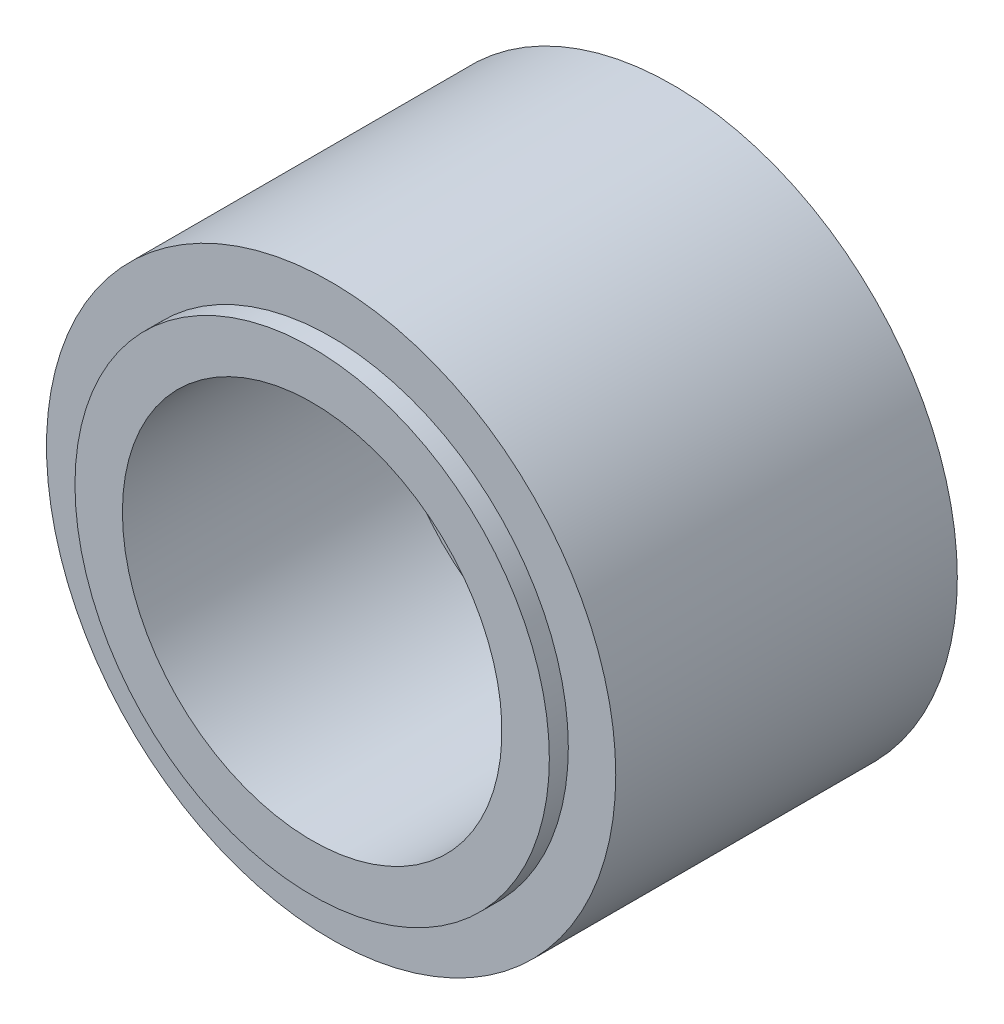
ISO-10303-21;
HEADER;
FILE_DESCRIPTION(('STEP AP214'),'2;1');
FILE_NAME('part.step','',(''),(''),'','','');
FILE_SCHEMA(('AUTOMOTIVE_DESIGN { 1 0 10303 214 1 1 1 1 }'));
ENDSEC;
DATA;
#1=APPLICATION_CONTEXT('core data for automotive mechanical design processes');
#2=APPLICATION_PROTOCOL_DEFINITION('international standard','automotive_design',2000,#1);
#3=PRODUCT_CONTEXT('',#1,'mechanical');
#4=PRODUCT('Part','Part','',(#3));
#5=PRODUCT_RELATED_PRODUCT_CATEGORY('part','',(#4));
#6=PRODUCT_DEFINITION_FORMATION('','',#4);
#7=PRODUCT_DEFINITION_CONTEXT('part definition',#1,'design');
#8=PRODUCT_DEFINITION('design','',#6,#7);
#9=PRODUCT_DEFINITION_SHAPE('','',#8);
#10=(LENGTH_UNIT() NAMED_UNIT(*) SI_UNIT(.MILLI.,.METRE.));
#11=(NAMED_UNIT(*) PLANE_ANGLE_UNIT() SI_UNIT($,.RADIAN.));
#12=(NAMED_UNIT(*) SI_UNIT($,.STERADIAN.) SOLID_ANGLE_UNIT());
#13=UNCERTAINTY_MEASURE_WITH_UNIT(LENGTH_MEASURE(1.E-05),#10,'distance_accuracy_value','');
#14=(GEOMETRIC_REPRESENTATION_CONTEXT(3) GLOBAL_UNCERTAINTY_ASSIGNED_CONTEXT((#13)) GLOBAL_UNIT_ASSIGNED_CONTEXT((#10,
#11,#12)) REPRESENTATION_CONTEXT('',''));
#15=CARTESIAN_POINT('',(0.,0.,0.));
#16=DIRECTION('',(0.,0.,1.));
#17=DIRECTION('',(1.,0.,0.));
#18=AXIS2_PLACEMENT_3D('',#15,#16,#17);
#19=CARTESIAN_POINT('',(0.,0.,61.4264068711929));
#20=DIRECTION('',(0.,0.,-1.));
#21=DIRECTION('',(-1.,0.,0.));
#22=AXIS2_PLACEMENT_3D('',#19,#20,#21);
#23=CYLINDRICAL_SURFACE('',#22,15.);
#24=CARTESIAN_POINT('',(0.,0.,0.999999999999999));
#25=DIRECTION('',(0.,0.,1.));
#26=DIRECTION('',(1.,0.,0.));
#27=AXIS2_PLACEMENT_3D('',#24,#25,#26);
#28=CIRCLE('',#27,15.);
#29=CARTESIAN_POINT('',(15.,0.,0.999999999999999));
#30=VERTEX_POINT('',#29);
#31=EDGE_CURVE('E61',#30,#30,#28,.T.);
#32=ORIENTED_EDGE('',*,*,#31,.T.);
#33=EDGE_LOOP('',(#32));
#34=FACE_BOUND('',#33,.T.);
#35=CARTESIAN_POINT('',(0.,0.,19.));
#36=DIRECTION('',(0.,0.,1.));
#37=DIRECTION('',(1.,0.,0.));
#38=AXIS2_PLACEMENT_3D('',#35,#36,#37);
#39=CIRCLE('',#38,15.);
#40=CARTESIAN_POINT('',(15.,0.,19.));
#41=VERTEX_POINT('',#40);
#42=EDGE_CURVE('E11',#41,#41,#39,.T.);
#43=ORIENTED_EDGE('',*,*,#42,.F.);
#44=EDGE_LOOP('',(#43));
#45=FACE_BOUND('',#44,.T.);
#46=ADVANCED_FACE('F54',(#34,#45),#23,.T.);
#47=CARTESIAN_POINT('',(0.,0.,0.999999999999999));
#48=DIRECTION('',(0.,0.,1.));
#49=DIRECTION('',(1.,0.,0.));
#50=AXIS2_PLACEMENT_3D('',#47,#48,#49);
#51=PLANE('',#50);
#52=ORIENTED_EDGE('',*,*,#31,.F.);
#53=EDGE_LOOP('',(#52));
#54=FACE_BOUND('',#53,.T.);
#55=CARTESIAN_POINT('',(0.,0.,0.999999999999999));
#56=DIRECTION('',(0.,0.,1.));
#57=DIRECTION('',(1.,0.,0.));
#58=AXIS2_PLACEMENT_3D('',#55,#56,#57);
#59=CIRCLE('',#58,12.5);
#60=CARTESIAN_POINT('',(12.5,0.,0.999999999999999));
#61=VERTEX_POINT('',#60);
#62=EDGE_CURVE('E66',#61,#61,#59,.T.);
#63=ORIENTED_EDGE('',*,*,#62,.T.);
#64=EDGE_LOOP('',(#63));
#65=FACE_BOUND('',#64,.T.);
#66=ADVANCED_FACE('F82',(#54,#65),#51,.F.);
#67=CARTESIAN_POINT('',(0.,0.,61.4264068711929));
#68=DIRECTION('',(0.,0.,-1.));
#69=DIRECTION('',(-1.,0.,0.));
#70=AXIS2_PLACEMENT_3D('',#67,#68,#69);
#71=CYLINDRICAL_SURFACE('',#70,12.5);
#72=ORIENTED_EDGE('',*,*,#62,.F.);
#73=EDGE_LOOP('',(#72));
#74=FACE_BOUND('',#73,.T.);
#75=CARTESIAN_POINT('',(0.,0.,19.));
#76=DIRECTION('',(0.,0.,1.));
#77=DIRECTION('',(1.,0.,0.));
#78=AXIS2_PLACEMENT_3D('',#75,#76,#77);
#79=CIRCLE('',#78,12.5);
#80=CARTESIAN_POINT('',(12.5,0.,19.));
#81=VERTEX_POINT('',#80);
#82=EDGE_CURVE('E57',#81,#81,#79,.T.);
#83=ORIENTED_EDGE('',*,*,#82,.T.);
#84=EDGE_LOOP('',(#83));
#85=FACE_BOUND('',#84,.T.);
#86=ADVANCED_FACE('F74',(#74,#85),#71,.F.);
#87=CARTESIAN_POINT('',(0.,-11.,19.));
#88=DIRECTION('',(0.,0.,1.));
#89=DIRECTION('',(1.,0.,0.));
#90=AXIS2_PLACEMENT_3D('',#87,#88,#89);
#91=PLANE('',#90);
#92=ORIENTED_EDGE('',*,*,#82,.F.);
#93=EDGE_LOOP('',(#92));
#94=FACE_BOUND('',#93,.T.);
#95=ORIENTED_EDGE('',*,*,#42,.T.);
#96=EDGE_LOOP('',(#95));
#97=FACE_BOUND('',#96,.T.);
#98=ADVANCED_FACE('F76',(#94,#97),#91,.T.);
#99=CLOSED_SHELL('',(#46,#66,#86,#98));
#100=MANIFOLD_SOLID_BREP('B2',#99);
#101=CARTESIAN_POINT('',(0.,0.,0.));
#102=DIRECTION('',(0.,0.,-1.));
#103=DIRECTION('',(-1.,0.,0.));
#104=AXIS2_PLACEMENT_3D('',#101,#102,#103);
#105=CYLINDRICAL_SURFACE('',#104,1.5);
#106=CARTESIAN_POINT('',(0.,0.,6.));
#107=DIRECTION('',(0.,0.,-1.));
#108=DIRECTION('',(-1.,0.,0.));
#109=AXIS2_PLACEMENT_3D('',#106,#107,#108);
#110=CIRCLE('',#109,1.5);
#111=CARTESIAN_POINT('',(-1.5,0.,6.));
#112=VERTEX_POINT('',#111);
#113=EDGE_CURVE('E165',#112,#112,#110,.T.);
#114=ORIENTED_EDGE('',*,*,#113,.F.);
#115=EDGE_LOOP('',(#114));
#116=FACE_BOUND('',#115,.T.);
#117=CARTESIAN_POINT('',(0.,0.,0.));
#118=DIRECTION('',(0.,0.,-1.));
#119=DIRECTION('',(-1.,0.,0.));
#120=AXIS2_PLACEMENT_3D('',#117,#118,#119);
#121=CIRCLE('',#120,1.5);
#122=CARTESIAN_POINT('',(-1.5,0.,0.));
#123=VERTEX_POINT('',#122);
#124=EDGE_CURVE('E53',#123,#123,#121,.T.);
#125=ORIENTED_EDGE('',*,*,#124,.T.);
#126=EDGE_LOOP('',(#125));
#127=FACE_BOUND('',#126,.T.);
#128=ADVANCED_FACE('F131',(#116,#127),#105,.F.);
#129=CARTESIAN_POINT('',(0.,-1.5,0.));
#130=DIRECTION('',(0.,0.,1.));
#131=DIRECTION('',(1.,0.,0.));
#132=AXIS2_PLACEMENT_3D('',#129,#130,#131);
#133=PLANE('',#132);
#134=ORIENTED_EDGE('',*,*,#124,.F.);
#135=EDGE_LOOP('',(#134));
#136=FACE_BOUND('',#135,.T.);
#137=CARTESIAN_POINT('',(0.,0.,0.));
#138=DIRECTION('',(0.,0.,-1.));
#139=DIRECTION('',(-1.,0.,0.));
#140=AXIS2_PLACEMENT_3D('',#137,#138,#139);
#141=CIRCLE('',#140,12.5);
#142=CARTESIAN_POINT('',(-12.5,0.,0.));
#143=VERTEX_POINT('',#142);
#144=EDGE_CURVE('E137',#143,#143,#141,.T.);
#145=ORIENTED_EDGE('',*,*,#144,.T.);
#146=EDGE_LOOP('',(#145));
#147=FACE_BOUND('',#146,.T.);
#148=ADVANCED_FACE('F172',(#136,#147),#133,.F.);
#149=CARTESIAN_POINT('',(0.,0.,0.));
#150=DIRECTION('',(0.,0.,-1.));
#151=DIRECTION('',(-1.,0.,0.));
#152=AXIS2_PLACEMENT_3D('',#149,#150,#151);
#153=CYLINDRICAL_SURFACE('',#152,12.5);
#154=ORIENTED_EDGE('',*,*,#144,.F.);
#155=EDGE_LOOP('',(#154));
#156=FACE_BOUND('',#155,.T.);
#157=CARTESIAN_POINT('',(0.,0.,0.999999999999999));
#158=DIRECTION('',(0.,0.,-1.));
#159=DIRECTION('',(-1.,0.,0.));
#160=AXIS2_PLACEMENT_3D('',#157,#158,#159);
#161=CIRCLE('',#160,12.5);
#162=CARTESIAN_POINT('',(-12.5,0.,0.999999999999999));
#163=VERTEX_POINT('',#162);
#164=EDGE_CURVE('E141',#163,#163,#161,.T.);
#165=ORIENTED_EDGE('',*,*,#164,.T.);
#166=EDGE_LOOP('',(#165));
#167=FACE_BOUND('',#166,.T.);
#168=ADVANCED_FACE('F176',(#156,#167),#153,.T.);
#169=CARTESIAN_POINT('',(0.,-12.5,0.999999999999999));
#170=DIRECTION('',(0.,0.,-1.));
#171=DIRECTION('',(-1.,0.,0.));
#172=AXIS2_PLACEMENT_3D('',#169,#170,#171);
#173=PLANE('',#172);
#174=ORIENTED_EDGE('',*,*,#164,.F.);
#175=EDGE_LOOP('',(#174));
#176=FACE_BOUND('',#175,.T.);
#177=CARTESIAN_POINT('',(0.,0.,0.999999999999999));
#178=DIRECTION('',(0.,0.,-1.));
#179=DIRECTION('',(-1.,0.,0.));
#180=AXIS2_PLACEMENT_3D('',#177,#178,#179);
#181=CIRCLE('',#180,11.);
#182=CARTESIAN_POINT('',(-11.,0.,0.999999999999999));
#183=VERTEX_POINT('',#182);
#184=EDGE_CURVE('E145',#183,#183,#181,.T.);
#185=ORIENTED_EDGE('',*,*,#184,.T.);
#186=EDGE_LOOP('',(#185));
#187=FACE_BOUND('',#186,.T.);
#188=ADVANCED_FACE('F181',(#176,#187),#173,.F.);
#189=CARTESIAN_POINT('',(0.,0.,0.));
#190=DIRECTION('',(0.,0.,-1.));
#191=DIRECTION('',(-1.,0.,0.));
#192=AXIS2_PLACEMENT_3D('',#189,#190,#191);
#193=CYLINDRICAL_SURFACE('',#192,11.);
#194=ORIENTED_EDGE('',*,*,#184,.F.);
#195=EDGE_LOOP('',(#194));
#196=FACE_BOUND('',#195,.T.);
#197=CARTESIAN_POINT('',(0.,0.,19.));
#198=DIRECTION('',(0.,0.,-1.));
#199=DIRECTION('',(-1.,0.,0.));
#200=AXIS2_PLACEMENT_3D('',#197,#198,#199);
#201=CIRCLE('',#200,11.);
#202=CARTESIAN_POINT('',(-11.,0.,19.));
#203=VERTEX_POINT('',#202);
#204=EDGE_CURVE('E150',#203,#203,#201,.T.);
#205=ORIENTED_EDGE('',*,*,#204,.T.);
#206=EDGE_LOOP('',(#205));
#207=FACE_BOUND('',#206,.T.);
#208=ADVANCED_FACE('F187',(#196,#207),#193,.T.);
#209=CARTESIAN_POINT('',(0.,-11.,19.));
#210=DIRECTION('',(0.,0.,1.));
#211=DIRECTION('',(1.,0.,0.));
#212=AXIS2_PLACEMENT_3D('',#209,#210,#211);
#213=PLANE('',#212);
#214=ORIENTED_EDGE('',*,*,#204,.F.);
#215=EDGE_LOOP('',(#214));
#216=FACE_BOUND('',#215,.T.);
#217=CARTESIAN_POINT('',(0.,0.,19.));
#218=DIRECTION('',(0.,0.,-1.));
#219=DIRECTION('',(-1.,0.,0.));
#220=AXIS2_PLACEMENT_3D('',#217,#218,#219);
#221=CIRCLE('',#220,12.5);
#222=CARTESIAN_POINT('',(-12.5,0.,19.));
#223=VERTEX_POINT('',#222);
#224=EDGE_CURVE('E153',#223,#223,#221,.T.);
#225=ORIENTED_EDGE('',*,*,#224,.T.);
#226=EDGE_LOOP('',(#225));
#227=FACE_BOUND('',#226,.T.);
#228=ADVANCED_FACE('F191',(#216,#227),#213,.F.);
#229=CARTESIAN_POINT('',(0.,0.,0.));
#230=DIRECTION('',(0.,0.,-1.));
#231=DIRECTION('',(-1.,0.,0.));
#232=AXIS2_PLACEMENT_3D('',#229,#230,#231);
#233=CYLINDRICAL_SURFACE('',#232,12.5);
#234=ORIENTED_EDGE('',*,*,#224,.F.);
#235=EDGE_LOOP('',(#234));
#236=FACE_BOUND('',#235,.T.);
#237=CARTESIAN_POINT('',(0.,0.,20.));
#238=DIRECTION('',(0.,0.,-1.));
#239=DIRECTION('',(-1.,0.,0.));
#240=AXIS2_PLACEMENT_3D('',#237,#238,#239);
#241=CIRCLE('',#240,12.5);
#242=CARTESIAN_POINT('',(-12.5,0.,20.));
#243=VERTEX_POINT('',#242);
#244=EDGE_CURVE('E156',#243,#243,#241,.T.);
#245=ORIENTED_EDGE('',*,*,#244,.T.);
#246=EDGE_LOOP('',(#245));
#247=FACE_BOUND('',#246,.T.);
#248=ADVANCED_FACE('F195',(#236,#247),#233,.T.);
#249=CARTESIAN_POINT('',(0.,-12.5,20.));
#250=DIRECTION('',(0.,0.,-1.));
#251=DIRECTION('',(-1.,0.,0.));
#252=AXIS2_PLACEMENT_3D('',#249,#250,#251);
#253=PLANE('',#252);
#254=ORIENTED_EDGE('',*,*,#244,.F.);
#255=EDGE_LOOP('',(#254));
#256=FACE_BOUND('',#255,.T.);
#257=CARTESIAN_POINT('',(0.,0.,20.));
#258=DIRECTION('',(0.,0.,-1.));
#259=DIRECTION('',(-1.,0.,0.));
#260=AXIS2_PLACEMENT_3D('',#257,#258,#259);
#261=CIRCLE('',#260,10.);
#262=CARTESIAN_POINT('',(-10.,0.,20.));
#263=VERTEX_POINT('',#262);
#264=EDGE_CURVE('E159',#263,#263,#261,.T.);
#265=ORIENTED_EDGE('',*,*,#264,.T.);
#266=EDGE_LOOP('',(#265));
#267=FACE_BOUND('',#266,.T.);
#268=ADVANCED_FACE('F199',(#256,#267),#253,.F.);
#269=CARTESIAN_POINT('',(0.,0.,0.));
#270=DIRECTION('',(0.,0.,-1.));
#271=DIRECTION('',(-1.,0.,0.));
#272=AXIS2_PLACEMENT_3D('',#269,#270,#271);
#273=CYLINDRICAL_SURFACE('',#272,10.);
#274=ORIENTED_EDGE('',*,*,#264,.F.);
#275=EDGE_LOOP('',(#274));
#276=FACE_BOUND('',#275,.T.);
#277=CARTESIAN_POINT('',(0.,0.,6.));
#278=DIRECTION('',(0.,0.,-1.));
#279=DIRECTION('',(-1.,0.,0.));
#280=AXIS2_PLACEMENT_3D('',#277,#278,#279);
#281=CIRCLE('',#280,10.);
#282=CARTESIAN_POINT('',(-10.,0.,6.));
#283=VERTEX_POINT('',#282);
#284=EDGE_CURVE('E162',#283,#283,#281,.T.);
#285=ORIENTED_EDGE('',*,*,#284,.T.);
#286=EDGE_LOOP('',(#285));
#287=FACE_BOUND('',#286,.T.);
#288=ADVANCED_FACE('F203',(#276,#287),#273,.F.);
#289=CARTESIAN_POINT('',(0.,-10.,6.));
#290=DIRECTION('',(0.,0.,-1.));
#291=DIRECTION('',(-1.,0.,0.));
#292=AXIS2_PLACEMENT_3D('',#289,#290,#291);
#293=PLANE('',#292);
#294=ORIENTED_EDGE('',*,*,#284,.F.);
#295=EDGE_LOOP('',(#294));
#296=FACE_BOUND('',#295,.T.);
#297=ORIENTED_EDGE('',*,*,#113,.T.);
#298=EDGE_LOOP('',(#297));
#299=FACE_BOUND('',#298,.T.);
#300=ADVANCED_FACE('F169',(#296,#299),#293,.F.);
#301=CLOSED_SHELL('',(#128,#148,#168,#188,#208,#228,#248,#268,#288,#300));
#302=MANIFOLD_SOLID_BREP('B6',#301);
#303=ADVANCED_BREP_SHAPE_REPRESENTATION('',(#18,#100,#302),#14);
#304=SHAPE_DEFINITION_REPRESENTATION(#9,#303);
ENDSEC;
END-ISO-10303-21;
